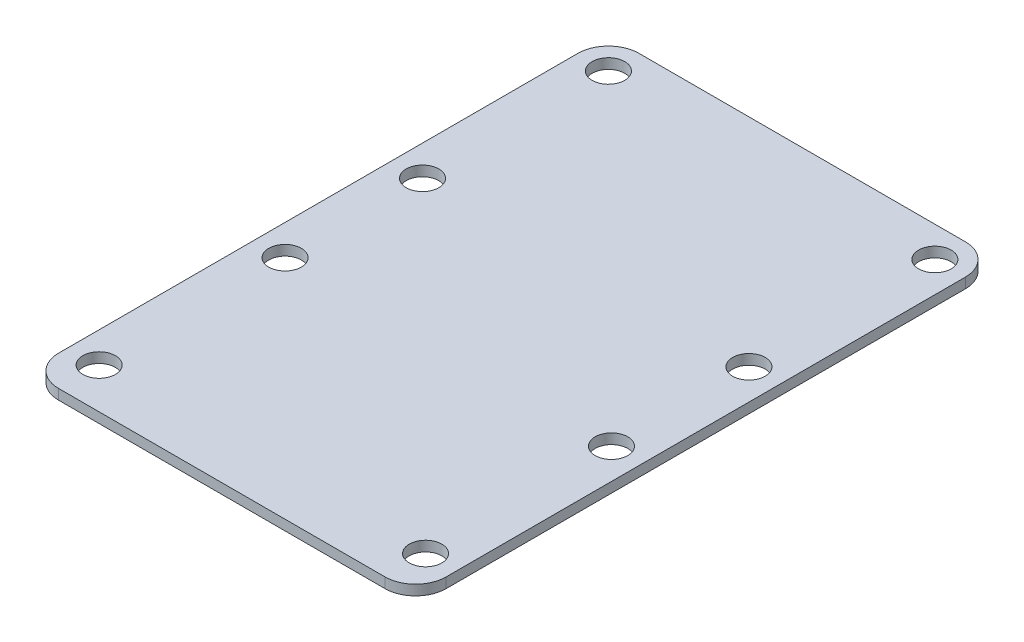
ISO-10303-21;
HEADER;
FILE_DESCRIPTION(('STEP AP214'),'2;1');
FILE_NAME('part.step','',(''),(''),'','','');
FILE_SCHEMA(('AUTOMOTIVE_DESIGN { 1 0 10303 214 1 1 1 1 }'));
ENDSEC;
DATA;
#1=APPLICATION_CONTEXT('core data for automotive mechanical design processes');
#2=APPLICATION_PROTOCOL_DEFINITION('international standard','automotive_design',2000,#1);
#3=PRODUCT_CONTEXT('',#1,'mechanical');
#4=PRODUCT('Part','Part','',(#3));
#5=PRODUCT_RELATED_PRODUCT_CATEGORY('part','',(#4));
#6=PRODUCT_DEFINITION_FORMATION('','',#4);
#7=PRODUCT_DEFINITION_CONTEXT('part definition',#1,'design');
#8=PRODUCT_DEFINITION('design','',#6,#7);
#9=PRODUCT_DEFINITION_SHAPE('','',#8);
#10=(LENGTH_UNIT() NAMED_UNIT(*) SI_UNIT(.MILLI.,.METRE.));
#11=(NAMED_UNIT(*) PLANE_ANGLE_UNIT() SI_UNIT($,.RADIAN.));
#12=(NAMED_UNIT(*) SI_UNIT($,.STERADIAN.) SOLID_ANGLE_UNIT());
#13=UNCERTAINTY_MEASURE_WITH_UNIT(LENGTH_MEASURE(1.E-05),#10,'distance_accuracy_value','');
#14=(GEOMETRIC_REPRESENTATION_CONTEXT(3) GLOBAL_UNCERTAINTY_ASSIGNED_CONTEXT((#13)) GLOBAL_UNIT_ASSIGNED_CONTEXT((#10,
#11,#12)) REPRESENTATION_CONTEXT('',''));
#15=CARTESIAN_POINT('',(0.,0.,0.));
#16=DIRECTION('',(0.,0.,1.));
#17=DIRECTION('',(1.,0.,0.));
#18=AXIS2_PLACEMENT_3D('',#15,#16,#17);
#19=CARTESIAN_POINT('',(38.06,1.,0.));
#20=DIRECTION('',(-1.,0.,0.));
#21=DIRECTION('',(0.,0.,1.));
#22=AXIS2_PLACEMENT_3D('',#19,#20,#21);
#23=PLANE('',#22);
#24=DIRECTION('',(0.,0.,-1.));
#25=VECTOR('',#24,1.);
#26=CARTESIAN_POINT('',(38.06,1.,0.));
#27=LINE('',#26,#25);
#28=CARTESIAN_POINT('',(38.06,1.,54.));
#29=VERTEX_POINT('',#28);
#30=CARTESIAN_POINT('',(38.06,1.,3.));
#31=VERTEX_POINT('',#30);
#32=EDGE_CURVE('E126',#29,#31,#27,.T.);
#33=ORIENTED_EDGE('',*,*,#32,.F.);
#34=DIRECTION('',(0.,-1.,0.));
#35=VECTOR('',#34,1.);
#36=CARTESIAN_POINT('',(38.06,1.,54.));
#37=LINE('',#36,#35);
#38=CARTESIAN_POINT('',(38.06,0.,54.));
#39=VERTEX_POINT('',#38);
#40=EDGE_CURVE('E152',#29,#39,#37,.T.);
#41=ORIENTED_EDGE('',*,*,#40,.T.);
#42=DIRECTION('',(0.,0.,-1.));
#43=VECTOR('',#42,1.);
#44=CARTESIAN_POINT('',(38.06,0.,0.));
#45=LINE('',#44,#43);
#46=CARTESIAN_POINT('',(38.06,0.,3.));
#47=VERTEX_POINT('',#46);
#48=EDGE_CURVE('E158',#39,#47,#45,.T.);
#49=ORIENTED_EDGE('',*,*,#48,.T.);
#50=DIRECTION('',(0.,-1.,0.));
#51=VECTOR('',#50,1.);
#52=CARTESIAN_POINT('',(38.06,1.,3.));
#53=LINE('',#52,#51);
#54=EDGE_CURVE('E150',#47,#31,#53,.F.);
#55=ORIENTED_EDGE('',*,*,#54,.T.);
#56=EDGE_LOOP('',(#33,#41,#49,#55));
#57=FACE_BOUND('',#56,.T.);
#58=ADVANCED_FACE('F34',(#57),#23,.F.);
#59=CARTESIAN_POINT('',(0.,1.,0.));
#60=DIRECTION('',(0.,0.,1.));
#61=DIRECTION('',(1.,0.,0.));
#62=AXIS2_PLACEMENT_3D('',#59,#60,#61);
#63=PLANE('',#62);
#64=DIRECTION('',(-1.,0.,0.));
#65=VECTOR('',#64,1.);
#66=CARTESIAN_POINT('',(0.,1.,0.));
#67=LINE('',#66,#65);
#68=CARTESIAN_POINT('',(35.06,1.,0.));
#69=VERTEX_POINT('',#68);
#70=CARTESIAN_POINT('',(3.,1.,0.));
#71=VERTEX_POINT('',#70);
#72=EDGE_CURVE('E129',#69,#71,#67,.T.);
#73=ORIENTED_EDGE('',*,*,#72,.F.);
#74=DIRECTION('',(0.,-1.,0.));
#75=VECTOR('',#74,1.);
#76=CARTESIAN_POINT('',(35.06,1.,0.));
#77=LINE('',#76,#75);
#78=CARTESIAN_POINT('',(35.06,0.,0.));
#79=VERTEX_POINT('',#78);
#80=EDGE_CURVE('E11',#69,#79,#77,.T.);
#81=ORIENTED_EDGE('',*,*,#80,.T.);
#82=DIRECTION('',(-1.,0.,0.));
#83=VECTOR('',#82,1.);
#84=CARTESIAN_POINT('',(0.,0.,0.));
#85=LINE('',#84,#83);
#86=CARTESIAN_POINT('',(3.,0.,0.));
#87=VERTEX_POINT('',#86);
#88=EDGE_CURVE('E131',#79,#87,#85,.T.);
#89=ORIENTED_EDGE('',*,*,#88,.T.);
#90=DIRECTION('',(0.,-1.,0.));
#91=VECTOR('',#90,1.);
#92=CARTESIAN_POINT('',(3.,1.,0.));
#93=LINE('',#92,#91);
#94=EDGE_CURVE('E42',#87,#71,#93,.F.);
#95=ORIENTED_EDGE('',*,*,#94,.T.);
#96=EDGE_LOOP('',(#73,#81,#89,#95));
#97=FACE_BOUND('',#96,.T.);
#98=ADVANCED_FACE('F251',(#97),#63,.F.);
#99=CARTESIAN_POINT('',(0.,1.,0.));
#100=DIRECTION('',(1.,0.,0.));
#101=DIRECTION('',(0.,0.,-1.));
#102=AXIS2_PLACEMENT_3D('',#99,#100,#101);
#103=PLANE('',#102);
#104=DIRECTION('',(0.,0.,1.));
#105=VECTOR('',#104,1.);
#106=CARTESIAN_POINT('',(0.,0.,0.));
#107=LINE('',#106,#105);
#108=CARTESIAN_POINT('',(0.,0.,3.));
#109=VERTEX_POINT('',#108);
#110=CARTESIAN_POINT('',(0.,0.,54.));
#111=VERTEX_POINT('',#110);
#112=EDGE_CURVE('E127',#109,#111,#107,.T.);
#113=ORIENTED_EDGE('',*,*,#112,.T.);
#114=DIRECTION('',(0.,-1.,0.));
#115=VECTOR('',#114,1.);
#116=CARTESIAN_POINT('',(0.,1.,54.));
#117=LINE('',#116,#115);
#118=CARTESIAN_POINT('',(0.,1.,54.));
#119=VERTEX_POINT('',#118);
#120=EDGE_CURVE('E105',#111,#119,#117,.F.);
#121=ORIENTED_EDGE('',*,*,#120,.T.);
#122=DIRECTION('',(0.,0.,1.));
#123=VECTOR('',#122,1.);
#124=CARTESIAN_POINT('',(0.,1.,0.));
#125=LINE('',#124,#123);
#126=CARTESIAN_POINT('',(0.,1.,3.));
#127=VERTEX_POINT('',#126);
#128=EDGE_CURVE('E170',#127,#119,#125,.T.);
#129=ORIENTED_EDGE('',*,*,#128,.F.);
#130=DIRECTION('',(0.,-1.,0.));
#131=VECTOR('',#130,1.);
#132=CARTESIAN_POINT('',(0.,1.,3.));
#133=LINE('',#132,#131);
#134=EDGE_CURVE('E110',#127,#109,#133,.T.);
#135=ORIENTED_EDGE('',*,*,#134,.T.);
#136=EDGE_LOOP('',(#113,#121,#129,#135));
#137=FACE_BOUND('',#136,.T.);
#138=ADVANCED_FACE('F249',(#137),#103,.F.);
#139=CARTESIAN_POINT('',(0.,1.,57.));
#140=DIRECTION('',(0.,0.,-1.));
#141=DIRECTION('',(-1.,0.,0.));
#142=AXIS2_PLACEMENT_3D('',#139,#140,#141);
#143=PLANE('',#142);
#144=DIRECTION('',(1.,0.,0.));
#145=VECTOR('',#144,1.);
#146=CARTESIAN_POINT('',(0.,1.,57.));
#147=LINE('',#146,#145);
#148=CARTESIAN_POINT('',(3.00000000000001,1.,57.));
#149=VERTEX_POINT('',#148);
#150=CARTESIAN_POINT('',(35.06,1.,57.));
#151=VERTEX_POINT('',#150);
#152=EDGE_CURVE('E120',#149,#151,#147,.T.);
#153=ORIENTED_EDGE('',*,*,#152,.F.);
#154=DIRECTION('',(0.,-1.,0.));
#155=VECTOR('',#154,1.);
#156=CARTESIAN_POINT('',(3.00000000000001,1.,57.));
#157=LINE('',#156,#155);
#158=CARTESIAN_POINT('',(3.00000000000001,0.,57.));
#159=VERTEX_POINT('',#158);
#160=EDGE_CURVE('E104',#149,#159,#157,.T.);
#161=ORIENTED_EDGE('',*,*,#160,.T.);
#162=DIRECTION('',(1.,0.,0.));
#163=VECTOR('',#162,1.);
#164=CARTESIAN_POINT('',(0.,0.,57.));
#165=LINE('',#164,#163);
#166=CARTESIAN_POINT('',(35.06,0.,57.));
#167=VERTEX_POINT('',#166);
#168=EDGE_CURVE('E117',#159,#167,#165,.T.);
#169=ORIENTED_EDGE('',*,*,#168,.T.);
#170=DIRECTION('',(0.,-1.,0.));
#171=VECTOR('',#170,1.);
#172=CARTESIAN_POINT('',(35.06,1.,57.));
#173=LINE('',#172,#171);
#174=EDGE_CURVE('E122',#167,#151,#173,.F.);
#175=ORIENTED_EDGE('',*,*,#174,.T.);
#176=EDGE_LOOP('',(#153,#161,#169,#175));
#177=FACE_BOUND('',#176,.T.);
#178=ADVANCED_FACE('F116',(#177),#143,.F.);
#179=CARTESIAN_POINT('',(0.,1.,0.));
#180=DIRECTION('',(0.,1.,0.));
#181=DIRECTION('',(0.,0.,1.));
#182=AXIS2_PLACEMENT_3D('',#179,#180,#181);
#183=PLANE('',#182);
#184=CARTESIAN_POINT('',(35.06,1.,53.02));
#185=DIRECTION('',(0.,1.,0.));
#186=DIRECTION('',(0.,0.,1.));
#187=AXIS2_PLACEMENT_3D('',#184,#185,#186);
#188=CIRCLE('',#187,1.6);
#189=CARTESIAN_POINT('',(35.06,1.,54.62));
#190=VERTEX_POINT('',#189);
#191=EDGE_CURVE('E213',#190,#190,#188,.T.);
#192=ORIENTED_EDGE('',*,*,#191,.F.);
#193=EDGE_LOOP('',(#192));
#194=FACE_BOUND('',#193,.T.);
#195=CARTESIAN_POINT('',(3.00000000000001,1.,53.02));
#196=DIRECTION('',(0.,1.,0.));
#197=DIRECTION('',(0.,0.,1.));
#198=AXIS2_PLACEMENT_3D('',#195,#196,#197);
#199=CIRCLE('',#198,1.6);
#200=CARTESIAN_POINT('',(3.00000000000001,1.,54.62));
#201=VERTEX_POINT('',#200);
#202=EDGE_CURVE('E207',#201,#201,#199,.T.);
#203=ORIENTED_EDGE('',*,*,#202,.F.);
#204=EDGE_LOOP('',(#203));
#205=FACE_BOUND('',#204,.T.);
#206=CARTESIAN_POINT('',(35.06,1.,34.76));
#207=DIRECTION('',(0.,1.,0.));
#208=DIRECTION('',(0.,0.,1.));
#209=AXIS2_PLACEMENT_3D('',#206,#207,#208);
#210=CIRCLE('',#209,1.6);
#211=CARTESIAN_POINT('',(35.06,1.,36.36));
#212=VERTEX_POINT('',#211);
#213=EDGE_CURVE('E201',#212,#212,#210,.T.);
#214=ORIENTED_EDGE('',*,*,#213,.F.);
#215=EDGE_LOOP('',(#214));
#216=FACE_BOUND('',#215,.T.);
#217=CARTESIAN_POINT('',(3.00000000000001,1.,34.76));
#218=DIRECTION('',(0.,1.,0.));
#219=DIRECTION('',(0.,0.,1.));
#220=AXIS2_PLACEMENT_3D('',#217,#218,#219);
#221=CIRCLE('',#220,1.6);
#222=CARTESIAN_POINT('',(3.00000000000001,1.,36.36));
#223=VERTEX_POINT('',#222);
#224=EDGE_CURVE('E195',#223,#223,#221,.T.);
#225=ORIENTED_EDGE('',*,*,#224,.F.);
#226=EDGE_LOOP('',(#225));
#227=FACE_BOUND('',#226,.T.);
#228=CARTESIAN_POINT('',(35.06,1.,21.26));
#229=DIRECTION('',(0.,1.,0.));
#230=DIRECTION('',(0.,0.,1.));
#231=AXIS2_PLACEMENT_3D('',#228,#229,#230);
#232=CIRCLE('',#231,1.6);
#233=CARTESIAN_POINT('',(35.06,1.,22.86));
#234=VERTEX_POINT('',#233);
#235=EDGE_CURVE('E189',#234,#234,#232,.T.);
#236=ORIENTED_EDGE('',*,*,#235,.F.);
#237=EDGE_LOOP('',(#236));
#238=FACE_BOUND('',#237,.T.);
#239=CARTESIAN_POINT('',(35.06,1.,3.));
#240=DIRECTION('',(0.,1.,0.));
#241=DIRECTION('',(0.,0.,1.));
#242=AXIS2_PLACEMENT_3D('',#239,#240,#241);
#243=CIRCLE('',#242,1.6);
#244=CARTESIAN_POINT('',(35.06,1.,4.6));
#245=VERTEX_POINT('',#244);
#246=EDGE_CURVE('E183',#245,#245,#243,.T.);
#247=ORIENTED_EDGE('',*,*,#246,.F.);
#248=EDGE_LOOP('',(#247));
#249=FACE_BOUND('',#248,.T.);
#250=CARTESIAN_POINT('',(3.,1.,21.26));
#251=DIRECTION('',(0.,1.,0.));
#252=DIRECTION('',(0.,0.,1.));
#253=AXIS2_PLACEMENT_3D('',#250,#251,#252);
#254=CIRCLE('',#253,1.6);
#255=CARTESIAN_POINT('',(3.,1.,22.86));
#256=VERTEX_POINT('',#255);
#257=EDGE_CURVE('E177',#256,#256,#254,.T.);
#258=ORIENTED_EDGE('',*,*,#257,.F.);
#259=EDGE_LOOP('',(#258));
#260=FACE_BOUND('',#259,.T.);
#261=CARTESIAN_POINT('',(3.,1.,3.));
#262=DIRECTION('',(0.,1.,0.));
#263=DIRECTION('',(0.,0.,1.));
#264=AXIS2_PLACEMENT_3D('',#261,#262,#263);
#265=CIRCLE('',#264,1.6);
#266=CARTESIAN_POINT('',(3.,1.,4.6));
#267=VERTEX_POINT('',#266);
#268=EDGE_CURVE('E166',#267,#267,#265,.T.);
#269=ORIENTED_EDGE('',*,*,#268,.F.);
#270=EDGE_LOOP('',(#269));
#271=FACE_BOUND('',#270,.T.);
#272=ORIENTED_EDGE('',*,*,#128,.T.);
#273=CARTESIAN_POINT('',(3.00000000000001,1.,54.));
#274=DIRECTION('',(0.,1.,0.));
#275=DIRECTION('',(0.,0.,1.));
#276=AXIS2_PLACEMENT_3D('',#273,#274,#275);
#277=CIRCLE('',#276,3.);
#278=EDGE_CURVE('E148',#119,#149,#277,.T.);
#279=ORIENTED_EDGE('',*,*,#278,.T.);
#280=ORIENTED_EDGE('',*,*,#152,.T.);
#281=CARTESIAN_POINT('',(35.06,1.,54.));
#282=DIRECTION('',(0.,1.,0.));
#283=DIRECTION('',(0.,0.,1.));
#284=AXIS2_PLACEMENT_3D('',#281,#282,#283);
#285=CIRCLE('',#284,3.);
#286=EDGE_CURVE('E146',#151,#29,#285,.T.);
#287=ORIENTED_EDGE('',*,*,#286,.T.);
#288=ORIENTED_EDGE('',*,*,#32,.T.);
#289=CARTESIAN_POINT('',(35.06,1.,3.));
#290=DIRECTION('',(0.,1.,0.));
#291=DIRECTION('',(0.,0.,1.));
#292=AXIS2_PLACEMENT_3D('',#289,#290,#291);
#293=CIRCLE('',#292,3.);
#294=EDGE_CURVE('E55',#31,#69,#293,.T.);
#295=ORIENTED_EDGE('',*,*,#294,.T.);
#296=ORIENTED_EDGE('',*,*,#72,.T.);
#297=CARTESIAN_POINT('',(3.,1.,3.));
#298=DIRECTION('',(0.,1.,0.));
#299=DIRECTION('',(0.,0.,1.));
#300=AXIS2_PLACEMENT_3D('',#297,#298,#299);
#301=CIRCLE('',#300,3.);
#302=EDGE_CURVE('E143',#71,#127,#301,.T.);
#303=ORIENTED_EDGE('',*,*,#302,.T.);
#304=EDGE_LOOP('',(#272,#279,#280,#287,#288,#295,#296,#303));
#305=FACE_BOUND('',#304,.T.);
#306=ADVANCED_FACE('F228',(#194,#205,#216,#227,#238,#249,#260,#271,#305),#183,.T.);
#307=CARTESIAN_POINT('',(0.,0.,0.));
#308=DIRECTION('',(0.,1.,0.));
#309=DIRECTION('',(0.,0.,1.));
#310=AXIS2_PLACEMENT_3D('',#307,#308,#309);
#311=PLANE('',#310);
#312=CARTESIAN_POINT('',(35.06,0.,53.02));
#313=DIRECTION('',(0.,1.,0.));
#314=DIRECTION('',(0.,0.,1.));
#315=AXIS2_PLACEMENT_3D('',#312,#313,#314);
#316=CIRCLE('',#315,1.6);
#317=CARTESIAN_POINT('',(35.06,0.,54.62));
#318=VERTEX_POINT('',#317);
#319=EDGE_CURVE('E210',#318,#318,#316,.T.);
#320=ORIENTED_EDGE('',*,*,#319,.T.);
#321=EDGE_LOOP('',(#320));
#322=FACE_BOUND('',#321,.T.);
#323=CARTESIAN_POINT('',(3.00000000000001,0.,53.02));
#324=DIRECTION('',(0.,1.,0.));
#325=DIRECTION('',(0.,0.,1.));
#326=AXIS2_PLACEMENT_3D('',#323,#324,#325);
#327=CIRCLE('',#326,1.6);
#328=CARTESIAN_POINT('',(3.00000000000001,0.,54.62));
#329=VERTEX_POINT('',#328);
#330=EDGE_CURVE('E204',#329,#329,#327,.T.);
#331=ORIENTED_EDGE('',*,*,#330,.T.);
#332=EDGE_LOOP('',(#331));
#333=FACE_BOUND('',#332,.T.);
#334=CARTESIAN_POINT('',(35.06,0.,34.76));
#335=DIRECTION('',(0.,1.,0.));
#336=DIRECTION('',(0.,0.,1.));
#337=AXIS2_PLACEMENT_3D('',#334,#335,#336);
#338=CIRCLE('',#337,1.6);
#339=CARTESIAN_POINT('',(35.06,0.,36.36));
#340=VERTEX_POINT('',#339);
#341=EDGE_CURVE('E198',#340,#340,#338,.T.);
#342=ORIENTED_EDGE('',*,*,#341,.T.);
#343=EDGE_LOOP('',(#342));
#344=FACE_BOUND('',#343,.T.);
#345=CARTESIAN_POINT('',(3.00000000000001,0.,34.76));
#346=DIRECTION('',(0.,1.,0.));
#347=DIRECTION('',(0.,0.,1.));
#348=AXIS2_PLACEMENT_3D('',#345,#346,#347);
#349=CIRCLE('',#348,1.6);
#350=CARTESIAN_POINT('',(3.00000000000001,0.,36.36));
#351=VERTEX_POINT('',#350);
#352=EDGE_CURVE('E192',#351,#351,#349,.T.);
#353=ORIENTED_EDGE('',*,*,#352,.T.);
#354=EDGE_LOOP('',(#353));
#355=FACE_BOUND('',#354,.T.);
#356=CARTESIAN_POINT('',(35.06,0.,21.26));
#357=DIRECTION('',(0.,1.,0.));
#358=DIRECTION('',(0.,0.,1.));
#359=AXIS2_PLACEMENT_3D('',#356,#357,#358);
#360=CIRCLE('',#359,1.6);
#361=CARTESIAN_POINT('',(35.06,0.,22.86));
#362=VERTEX_POINT('',#361);
#363=EDGE_CURVE('E186',#362,#362,#360,.T.);
#364=ORIENTED_EDGE('',*,*,#363,.T.);
#365=EDGE_LOOP('',(#364));
#366=FACE_BOUND('',#365,.T.);
#367=CARTESIAN_POINT('',(35.06,0.,3.));
#368=DIRECTION('',(0.,1.,0.));
#369=DIRECTION('',(0.,0.,1.));
#370=AXIS2_PLACEMENT_3D('',#367,#368,#369);
#371=CIRCLE('',#370,1.6);
#372=CARTESIAN_POINT('',(35.06,0.,4.6));
#373=VERTEX_POINT('',#372);
#374=EDGE_CURVE('E180',#373,#373,#371,.T.);
#375=ORIENTED_EDGE('',*,*,#374,.T.);
#376=EDGE_LOOP('',(#375));
#377=FACE_BOUND('',#376,.T.);
#378=CARTESIAN_POINT('',(3.,0.,21.26));
#379=DIRECTION('',(0.,1.,0.));
#380=DIRECTION('',(0.,0.,1.));
#381=AXIS2_PLACEMENT_3D('',#378,#379,#380);
#382=CIRCLE('',#381,1.6);
#383=CARTESIAN_POINT('',(3.,0.,22.86));
#384=VERTEX_POINT('',#383);
#385=EDGE_CURVE('E175',#384,#384,#382,.T.);
#386=ORIENTED_EDGE('',*,*,#385,.T.);
#387=EDGE_LOOP('',(#386));
#388=FACE_BOUND('',#387,.T.);
#389=CARTESIAN_POINT('',(3.,0.,3.));
#390=DIRECTION('',(0.,1.,0.));
#391=DIRECTION('',(0.,0.,1.));
#392=AXIS2_PLACEMENT_3D('',#389,#390,#391);
#393=CIRCLE('',#392,1.6);
#394=CARTESIAN_POINT('',(3.,0.,4.6));
#395=VERTEX_POINT('',#394);
#396=EDGE_CURVE('E163',#395,#395,#393,.T.);
#397=ORIENTED_EDGE('',*,*,#396,.T.);
#398=EDGE_LOOP('',(#397));
#399=FACE_BOUND('',#398,.T.);
#400=ORIENTED_EDGE('',*,*,#168,.F.);
#401=CARTESIAN_POINT('',(3.00000000000001,0.,54.));
#402=DIRECTION('',(0.,1.,0.));
#403=DIRECTION('',(0.,0.,1.));
#404=AXIS2_PLACEMENT_3D('',#401,#402,#403);
#405=CIRCLE('',#404,3.);
#406=EDGE_CURVE('E100',#159,#111,#405,.F.);
#407=ORIENTED_EDGE('',*,*,#406,.T.);
#408=ORIENTED_EDGE('',*,*,#112,.F.);
#409=CARTESIAN_POINT('',(3.,0.,3.));
#410=DIRECTION('',(0.,1.,0.));
#411=DIRECTION('',(0.,0.,1.));
#412=AXIS2_PLACEMENT_3D('',#409,#410,#411);
#413=CIRCLE('',#412,3.);
#414=EDGE_CURVE('E121',#109,#87,#413,.F.);
#415=ORIENTED_EDGE('',*,*,#414,.T.);
#416=ORIENTED_EDGE('',*,*,#88,.F.);
#417=CARTESIAN_POINT('',(35.06,0.,3.));
#418=DIRECTION('',(0.,1.,0.));
#419=DIRECTION('',(0.,0.,1.));
#420=AXIS2_PLACEMENT_3D('',#417,#418,#419);
#421=CIRCLE('',#420,3.);
#422=EDGE_CURVE('E137',#79,#47,#421,.F.);
#423=ORIENTED_EDGE('',*,*,#422,.T.);
#424=ORIENTED_EDGE('',*,*,#48,.F.);
#425=CARTESIAN_POINT('',(35.06,0.,54.));
#426=DIRECTION('',(0.,1.,0.));
#427=DIRECTION('',(0.,0.,1.));
#428=AXIS2_PLACEMENT_3D('',#425,#426,#427);
#429=CIRCLE('',#428,3.);
#430=EDGE_CURVE('E111',#39,#167,#429,.F.);
#431=ORIENTED_EDGE('',*,*,#430,.T.);
#432=EDGE_LOOP('',(#400,#407,#408,#415,#416,#423,#424,#431));
#433=FACE_BOUND('',#432,.T.);
#434=ADVANCED_FACE('F124',(#322,#333,#344,#355,#366,#377,#388,#399,#433),#311,.F.);
#435=CARTESIAN_POINT('',(3.00000000000001,1.,54.));
#436=DIRECTION('',(0.,-1.,0.));
#437=DIRECTION('',(0.,0.,-1.));
#438=AXIS2_PLACEMENT_3D('',#435,#436,#437);
#439=CYLINDRICAL_SURFACE('',#438,3.);
#440=ORIENTED_EDGE('',*,*,#278,.F.);
#441=ORIENTED_EDGE('',*,*,#120,.F.);
#442=ORIENTED_EDGE('',*,*,#406,.F.);
#443=ORIENTED_EDGE('',*,*,#160,.F.);
#444=EDGE_LOOP('',(#440,#441,#442,#443));
#445=FACE_BOUND('',#444,.T.);
#446=ADVANCED_FACE('F103',(#445),#439,.T.);
#447=CARTESIAN_POINT('',(35.06,1.,54.));
#448=DIRECTION('',(0.,-1.,0.));
#449=DIRECTION('',(0.,0.,-1.));
#450=AXIS2_PLACEMENT_3D('',#447,#448,#449);
#451=CYLINDRICAL_SURFACE('',#450,3.);
#452=ORIENTED_EDGE('',*,*,#286,.F.);
#453=ORIENTED_EDGE('',*,*,#174,.F.);
#454=ORIENTED_EDGE('',*,*,#430,.F.);
#455=ORIENTED_EDGE('',*,*,#40,.F.);
#456=EDGE_LOOP('',(#452,#453,#454,#455));
#457=FACE_BOUND('',#456,.T.);
#458=ADVANCED_FACE('F255',(#457),#451,.T.);
#459=CARTESIAN_POINT('',(35.06,1.,3.));
#460=DIRECTION('',(0.,-1.,0.));
#461=DIRECTION('',(0.,0.,-1.));
#462=AXIS2_PLACEMENT_3D('',#459,#460,#461);
#463=CYLINDRICAL_SURFACE('',#462,3.);
#464=ORIENTED_EDGE('',*,*,#294,.F.);
#465=ORIENTED_EDGE('',*,*,#54,.F.);
#466=ORIENTED_EDGE('',*,*,#422,.F.);
#467=ORIENTED_EDGE('',*,*,#80,.F.);
#468=EDGE_LOOP('',(#464,#465,#466,#467));
#469=FACE_BOUND('',#468,.T.);
#470=ADVANCED_FACE('F254',(#469),#463,.T.);
#471=CARTESIAN_POINT('',(3.,1.,3.));
#472=DIRECTION('',(0.,-1.,0.));
#473=DIRECTION('',(0.,0.,-1.));
#474=AXIS2_PLACEMENT_3D('',#471,#472,#473);
#475=CYLINDRICAL_SURFACE('',#474,3.);
#476=ORIENTED_EDGE('',*,*,#302,.F.);
#477=ORIENTED_EDGE('',*,*,#94,.F.);
#478=ORIENTED_EDGE('',*,*,#414,.F.);
#479=ORIENTED_EDGE('',*,*,#134,.F.);
#480=EDGE_LOOP('',(#476,#477,#478,#479));
#481=FACE_BOUND('',#480,.T.);
#482=ADVANCED_FACE('F36',(#481),#475,.T.);
#483=CARTESIAN_POINT('',(3.,0.,3.));
#484=DIRECTION('',(0.,1.,0.));
#485=DIRECTION('',(0.,0.,1.));
#486=AXIS2_PLACEMENT_3D('',#483,#484,#485);
#487=CYLINDRICAL_SURFACE('',#486,1.6);
#488=ORIENTED_EDGE('',*,*,#396,.F.);
#489=EDGE_LOOP('',(#488));
#490=FACE_BOUND('',#489,.T.);
#491=ORIENTED_EDGE('',*,*,#268,.T.);
#492=EDGE_LOOP('',(#491));
#493=FACE_BOUND('',#492,.T.);
#494=ADVANCED_FACE('F276',(#490,#493),#487,.F.);
#495=CARTESIAN_POINT('',(3.,0.,21.26));
#496=DIRECTION('',(0.,1.,0.));
#497=DIRECTION('',(0.,0.,1.));
#498=AXIS2_PLACEMENT_3D('',#495,#496,#497);
#499=CYLINDRICAL_SURFACE('',#498,1.6);
#500=ORIENTED_EDGE('',*,*,#385,.F.);
#501=EDGE_LOOP('',(#500));
#502=FACE_BOUND('',#501,.T.);
#503=ORIENTED_EDGE('',*,*,#257,.T.);
#504=EDGE_LOOP('',(#503));
#505=FACE_BOUND('',#504,.T.);
#506=ADVANCED_FACE('F279',(#502,#505),#499,.F.);
#507=CARTESIAN_POINT('',(35.06,0.,3.));
#508=DIRECTION('',(0.,1.,0.));
#509=DIRECTION('',(0.,0.,1.));
#510=AXIS2_PLACEMENT_3D('',#507,#508,#509);
#511=CYLINDRICAL_SURFACE('',#510,1.6);
#512=ORIENTED_EDGE('',*,*,#374,.F.);
#513=EDGE_LOOP('',(#512));
#514=FACE_BOUND('',#513,.T.);
#515=ORIENTED_EDGE('',*,*,#246,.T.);
#516=EDGE_LOOP('',(#515));
#517=FACE_BOUND('',#516,.T.);
#518=ADVANCED_FACE('F283',(#514,#517),#511,.F.);
#519=CARTESIAN_POINT('',(35.06,0.,21.26));
#520=DIRECTION('',(0.,1.,0.));
#521=DIRECTION('',(0.,0.,1.));
#522=AXIS2_PLACEMENT_3D('',#519,#520,#521);
#523=CYLINDRICAL_SURFACE('',#522,1.6);
#524=ORIENTED_EDGE('',*,*,#363,.F.);
#525=EDGE_LOOP('',(#524));
#526=FACE_BOUND('',#525,.T.);
#527=ORIENTED_EDGE('',*,*,#235,.T.);
#528=EDGE_LOOP('',(#527));
#529=FACE_BOUND('',#528,.T.);
#530=ADVANCED_FACE('F287',(#526,#529),#523,.F.);
#531=CARTESIAN_POINT('',(3.00000000000001,0.,34.76));
#532=DIRECTION('',(0.,1.,0.));
#533=DIRECTION('',(0.,0.,1.));
#534=AXIS2_PLACEMENT_3D('',#531,#532,#533);
#535=CYLINDRICAL_SURFACE('',#534,1.6);
#536=ORIENTED_EDGE('',*,*,#352,.F.);
#537=EDGE_LOOP('',(#536));
#538=FACE_BOUND('',#537,.T.);
#539=ORIENTED_EDGE('',*,*,#224,.T.);
#540=EDGE_LOOP('',(#539));
#541=FACE_BOUND('',#540,.T.);
#542=ADVANCED_FACE('F291',(#538,#541),#535,.F.);
#543=CARTESIAN_POINT('',(35.06,0.,34.76));
#544=DIRECTION('',(0.,1.,0.));
#545=DIRECTION('',(0.,0.,1.));
#546=AXIS2_PLACEMENT_3D('',#543,#544,#545);
#547=CYLINDRICAL_SURFACE('',#546,1.6);
#548=ORIENTED_EDGE('',*,*,#341,.F.);
#549=EDGE_LOOP('',(#548));
#550=FACE_BOUND('',#549,.T.);
#551=ORIENTED_EDGE('',*,*,#213,.T.);
#552=EDGE_LOOP('',(#551));
#553=FACE_BOUND('',#552,.T.);
#554=ADVANCED_FACE('F295',(#550,#553),#547,.F.);
#555=CARTESIAN_POINT('',(3.00000000000001,0.,53.02));
#556=DIRECTION('',(0.,1.,0.));
#557=DIRECTION('',(0.,0.,1.));
#558=AXIS2_PLACEMENT_3D('',#555,#556,#557);
#559=CYLINDRICAL_SURFACE('',#558,1.6);
#560=ORIENTED_EDGE('',*,*,#330,.F.);
#561=EDGE_LOOP('',(#560));
#562=FACE_BOUND('',#561,.T.);
#563=ORIENTED_EDGE('',*,*,#202,.T.);
#564=EDGE_LOOP('',(#563));
#565=FACE_BOUND('',#564,.T.);
#566=ADVANCED_FACE('F224',(#562,#565),#559,.F.);
#567=CARTESIAN_POINT('',(35.06,0.,53.02));
#568=DIRECTION('',(0.,1.,0.));
#569=DIRECTION('',(0.,0.,1.));
#570=AXIS2_PLACEMENT_3D('',#567,#568,#569);
#571=CYLINDRICAL_SURFACE('',#570,1.6);
#572=ORIENTED_EDGE('',*,*,#319,.F.);
#573=EDGE_LOOP('',(#572));
#574=FACE_BOUND('',#573,.T.);
#575=ORIENTED_EDGE('',*,*,#191,.T.);
#576=EDGE_LOOP('',(#575));
#577=FACE_BOUND('',#576,.T.);
#578=ADVANCED_FACE('F221',(#574,#577),#571,.F.);
#579=CLOSED_SHELL('',(#58,#98,#138,#178,#306,#434,#446,#458,#470,#482,#494,#506,#518,#530,#542,
#554,#566,#578));
#580=MANIFOLD_SOLID_BREP('B2',#579);
#581=ADVANCED_BREP_SHAPE_REPRESENTATION('',(#18,#580),#14);
#582=SHAPE_DEFINITION_REPRESENTATION(#9,#581);
ENDSEC;
END-ISO-10303-21;
